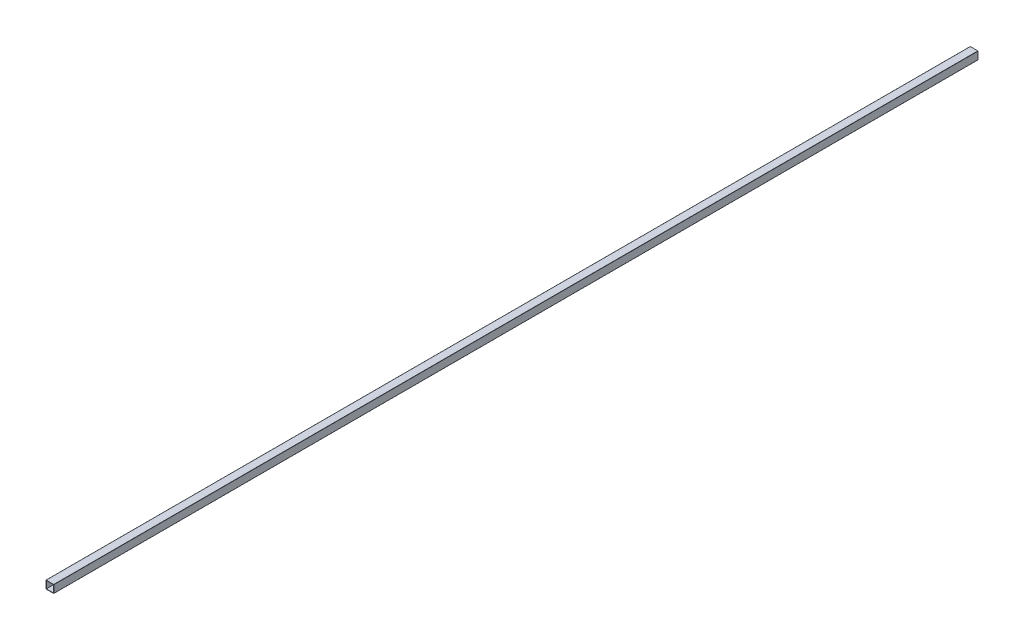
ISO-10303-21;
HEADER;
FILE_DESCRIPTION(('STEP AP214'),'2;1');
FILE_NAME('part.step','',(''),(''),'','','');
FILE_SCHEMA(('AUTOMOTIVE_DESIGN { 1 0 10303 214 1 1 1 1 }'));
ENDSEC;
DATA;
#1=APPLICATION_CONTEXT('core data for automotive mechanical design processes');
#2=APPLICATION_PROTOCOL_DEFINITION('international standard','automotive_design',2000,#1);
#3=PRODUCT_CONTEXT('',#1,'mechanical');
#4=PRODUCT('Part','Part','',(#3));
#5=PRODUCT_RELATED_PRODUCT_CATEGORY('part','',(#4));
#6=PRODUCT_DEFINITION_FORMATION('','',#4);
#7=PRODUCT_DEFINITION_CONTEXT('part definition',#1,'design');
#8=PRODUCT_DEFINITION('design','',#6,#7);
#9=PRODUCT_DEFINITION_SHAPE('','',#8);
#10=(LENGTH_UNIT() NAMED_UNIT(*) SI_UNIT(.MILLI.,.METRE.));
#11=(NAMED_UNIT(*) PLANE_ANGLE_UNIT() SI_UNIT($,.RADIAN.));
#12=(NAMED_UNIT(*) SI_UNIT($,.STERADIAN.) SOLID_ANGLE_UNIT());
#13=UNCERTAINTY_MEASURE_WITH_UNIT(LENGTH_MEASURE(1.E-05),#10,'distance_accuracy_value','');
#14=(GEOMETRIC_REPRESENTATION_CONTEXT(3) GLOBAL_UNCERTAINTY_ASSIGNED_CONTEXT((#13)) GLOBAL_UNIT_ASSIGNED_CONTEXT((#10,
#11,#12)) REPRESENTATION_CONTEXT('',''));
#15=CARTESIAN_POINT('',(0.,0.,0.));
#16=DIRECTION('',(0.,0.,1.));
#17=DIRECTION('',(1.,0.,0.));
#18=AXIS2_PLACEMENT_3D('',#15,#16,#17);
#19=CARTESIAN_POINT('',(24.4,-24.4,6000.));
#20=DIRECTION('',(0.,0.,-1.));
#21=DIRECTION('',(-1.,0.,0.));
#22=AXIS2_PLACEMENT_3D('',#19,#20,#21);
#23=PLANE('',#22);
#24=CARTESIAN_POINT('',(24.4,-24.4,6000.));
#25=DIRECTION('',(0.,0.,1.));
#26=DIRECTION('',(-1.,0.,0.));
#27=AXIS2_PLACEMENT_3D('',#24,#25,#26);
#28=CIRCLE('',#27,1.);
#29=CARTESIAN_POINT('',(24.4,-25.4,6000.));
#30=VERTEX_POINT('',#29);
#31=CARTESIAN_POINT('',(25.4,-24.4,6000.));
#32=VERTEX_POINT('',#31);
#33=EDGE_CURVE('E158',#30,#32,#28,.T.);
#34=ORIENTED_EDGE('',*,*,#33,.T.);
#35=DIRECTION('',(0.,1.,0.));
#36=VECTOR('',#35,1.);
#37=CARTESIAN_POINT('',(25.4,-24.4,6000.));
#38=LINE('',#37,#36);
#39=CARTESIAN_POINT('',(25.4,24.4,6000.));
#40=VERTEX_POINT('',#39);
#41=EDGE_CURVE('E161',#32,#40,#38,.T.);
#42=ORIENTED_EDGE('',*,*,#41,.T.);
#43=CARTESIAN_POINT('',(24.4,24.4,6000.));
#44=DIRECTION('',(0.,0.,1.));
#45=DIRECTION('',(1.,0.,0.));
#46=AXIS2_PLACEMENT_3D('',#43,#44,#45);
#47=CIRCLE('',#46,1.);
#48=CARTESIAN_POINT('',(24.4,25.4,6000.));
#49=VERTEX_POINT('',#48);
#50=EDGE_CURVE('E164',#40,#49,#47,.T.);
#51=ORIENTED_EDGE('',*,*,#50,.T.);
#52=DIRECTION('',(-1.,0.,0.));
#53=VECTOR('',#52,1.);
#54=CARTESIAN_POINT('',(-24.4,25.4,6000.));
#55=LINE('',#54,#53);
#56=CARTESIAN_POINT('',(-24.4,25.4,6000.));
#57=VERTEX_POINT('',#56);
#58=EDGE_CURVE('E166',#49,#57,#55,.T.);
#59=ORIENTED_EDGE('',*,*,#58,.T.);
#60=CARTESIAN_POINT('',(-24.4,24.4,6000.));
#61=DIRECTION('',(0.,0.,1.));
#62=DIRECTION('',(1.,0.,0.));
#63=AXIS2_PLACEMENT_3D('',#60,#61,#62);
#64=CIRCLE('',#63,1.);
#65=CARTESIAN_POINT('',(-25.4,24.4,6000.));
#66=VERTEX_POINT('',#65);
#67=EDGE_CURVE('E168',#57,#66,#64,.T.);
#68=ORIENTED_EDGE('',*,*,#67,.T.);
#69=DIRECTION('',(0.,-1.,0.));
#70=VECTOR('',#69,1.);
#71=CARTESIAN_POINT('',(-25.4,-24.4,6000.));
#72=LINE('',#71,#70);
#73=CARTESIAN_POINT('',(-25.4,-24.4,6000.));
#74=VERTEX_POINT('',#73);
#75=EDGE_CURVE('E170',#66,#74,#72,.T.);
#76=ORIENTED_EDGE('',*,*,#75,.T.);
#77=CARTESIAN_POINT('',(-24.4,-24.4,6000.));
#78=DIRECTION('',(0.,0.,1.));
#79=DIRECTION('',(1.,0.,0.));
#80=AXIS2_PLACEMENT_3D('',#77,#78,#79);
#81=CIRCLE('',#80,1.);
#82=CARTESIAN_POINT('',(-24.4,-25.4,6000.));
#83=VERTEX_POINT('',#82);
#84=EDGE_CURVE('E172',#74,#83,#81,.T.);
#85=ORIENTED_EDGE('',*,*,#84,.T.);
#86=DIRECTION('',(1.,0.,0.));
#87=VECTOR('',#86,1.);
#88=CARTESIAN_POINT('',(-24.4,-25.4,6000.));
#89=LINE('',#88,#87);
#90=EDGE_CURVE('E174',#83,#30,#89,.T.);
#91=ORIENTED_EDGE('',*,*,#90,.T.);
#92=EDGE_LOOP('',(#34,#42,#51,#59,#68,#76,#85,#91));
#93=FACE_BOUND('',#92,.T.);
#94=DIRECTION('',(1.,0.,0.));
#95=VECTOR('',#94,1.);
#96=CARTESIAN_POINT('',(-23.51,-23.51,6000.));
#97=LINE('',#96,#95);
#98=CARTESIAN_POINT('',(-23.51,-23.51,6000.));
#99=VERTEX_POINT('',#98);
#100=CARTESIAN_POINT('',(23.51,-23.51,6000.));
#101=VERTEX_POINT('',#100);
#102=EDGE_CURVE('E122',#99,#101,#97,.T.);
#103=ORIENTED_EDGE('',*,*,#102,.F.);
#104=DIRECTION('',(0.,-1.,0.));
#105=VECTOR('',#104,1.);
#106=CARTESIAN_POINT('',(-23.51,-23.51,6000.));
#107=LINE('',#106,#105);
#108=CARTESIAN_POINT('',(-23.51,23.51,6000.));
#109=VERTEX_POINT('',#108);
#110=EDGE_CURVE('E144',#109,#99,#107,.T.);
#111=ORIENTED_EDGE('',*,*,#110,.F.);
#112=DIRECTION('',(-1.,0.,0.));
#113=VECTOR('',#112,1.);
#114=CARTESIAN_POINT('',(-23.51,23.51,6000.));
#115=LINE('',#114,#113);
#116=CARTESIAN_POINT('',(23.51,23.51,6000.));
#117=VERTEX_POINT('',#116);
#118=EDGE_CURVE('E142',#117,#109,#115,.T.);
#119=ORIENTED_EDGE('',*,*,#118,.F.);
#120=DIRECTION('',(0.,1.,0.));
#121=VECTOR('',#120,1.);
#122=CARTESIAN_POINT('',(23.51,-23.51,6000.));
#123=LINE('',#122,#121);
#124=EDGE_CURVE('E130',#101,#117,#123,.T.);
#125=ORIENTED_EDGE('',*,*,#124,.F.);
#126=EDGE_LOOP('',(#103,#111,#119,#125));
#127=FACE_BOUND('',#126,.T.);
#128=ADVANCED_FACE('F33',(#93,#127),#23,.F.);
#129=CARTESIAN_POINT('',(24.4,-24.4,0.));
#130=DIRECTION('',(0.,0.,-1.));
#131=DIRECTION('',(-1.,0.,0.));
#132=AXIS2_PLACEMENT_3D('',#129,#130,#131);
#133=PLANE('',#132);
#134=CARTESIAN_POINT('',(24.4,-24.4,0.));
#135=DIRECTION('',(0.,0.,1.));
#136=DIRECTION('',(-1.,0.,0.));
#137=AXIS2_PLACEMENT_3D('',#134,#135,#136);
#138=CIRCLE('',#137,1.);
#139=CARTESIAN_POINT('',(24.4,-25.4,0.));
#140=VERTEX_POINT('',#139);
#141=CARTESIAN_POINT('',(25.4,-24.4,0.));
#142=VERTEX_POINT('',#141);
#143=EDGE_CURVE('E138',#140,#142,#138,.T.);
#144=ORIENTED_EDGE('',*,*,#143,.F.);
#145=DIRECTION('',(1.,0.,0.));
#146=VECTOR('',#145,1.);
#147=CARTESIAN_POINT('',(-24.4,-25.4,0.));
#148=LINE('',#147,#146);
#149=CARTESIAN_POINT('',(-24.4,-25.4,0.));
#150=VERTEX_POINT('',#149);
#151=EDGE_CURVE('E162',#150,#140,#148,.T.);
#152=ORIENTED_EDGE('',*,*,#151,.F.);
#153=CARTESIAN_POINT('',(-24.4,-24.4,0.));
#154=DIRECTION('',(0.,0.,1.));
#155=DIRECTION('',(1.,0.,0.));
#156=AXIS2_PLACEMENT_3D('',#153,#154,#155);
#157=CIRCLE('',#156,1.);
#158=CARTESIAN_POINT('',(-25.4,-24.4,0.));
#159=VERTEX_POINT('',#158);
#160=EDGE_CURVE('E189',#159,#150,#157,.T.);
#161=ORIENTED_EDGE('',*,*,#160,.F.);
#162=DIRECTION('',(0.,-1.,0.));
#163=VECTOR('',#162,1.);
#164=CARTESIAN_POINT('',(-25.4,-24.4,0.));
#165=LINE('',#164,#163);
#166=CARTESIAN_POINT('',(-25.4,24.4,0.));
#167=VERTEX_POINT('',#166);
#168=EDGE_CURVE('E187',#167,#159,#165,.T.);
#169=ORIENTED_EDGE('',*,*,#168,.F.);
#170=CARTESIAN_POINT('',(-24.4,24.4,0.));
#171=DIRECTION('',(0.,0.,1.));
#172=DIRECTION('',(1.,0.,0.));
#173=AXIS2_PLACEMENT_3D('',#170,#171,#172);
#174=CIRCLE('',#173,1.);
#175=CARTESIAN_POINT('',(-24.4,25.4,0.));
#176=VERTEX_POINT('',#175);
#177=EDGE_CURVE('E185',#176,#167,#174,.T.);
#178=ORIENTED_EDGE('',*,*,#177,.F.);
#179=DIRECTION('',(-1.,0.,0.));
#180=VECTOR('',#179,1.);
#181=CARTESIAN_POINT('',(-24.4,25.4,0.));
#182=LINE('',#181,#180);
#183=CARTESIAN_POINT('',(24.4,25.4,0.));
#184=VERTEX_POINT('',#183);
#185=EDGE_CURVE('E183',#184,#176,#182,.T.);
#186=ORIENTED_EDGE('',*,*,#185,.F.);
#187=CARTESIAN_POINT('',(24.4,24.4,0.));
#188=DIRECTION('',(0.,0.,1.));
#189=DIRECTION('',(1.,0.,0.));
#190=AXIS2_PLACEMENT_3D('',#187,#188,#189);
#191=CIRCLE('',#190,1.);
#192=CARTESIAN_POINT('',(25.4,24.4,0.));
#193=VERTEX_POINT('',#192);
#194=EDGE_CURVE('E181',#193,#184,#191,.T.);
#195=ORIENTED_EDGE('',*,*,#194,.F.);
#196=DIRECTION('',(0.,1.,0.));
#197=VECTOR('',#196,1.);
#198=CARTESIAN_POINT('',(25.4,-24.4,0.));
#199=LINE('',#198,#197);
#200=EDGE_CURVE('E179',#142,#193,#199,.T.);
#201=ORIENTED_EDGE('',*,*,#200,.F.);
#202=EDGE_LOOP('',(#144,#152,#161,#169,#178,#186,#195,#201));
#203=FACE_BOUND('',#202,.T.);
#204=DIRECTION('',(0.,-1.,0.));
#205=VECTOR('',#204,1.);
#206=CARTESIAN_POINT('',(-23.51,-23.51,0.));
#207=LINE('',#206,#205);
#208=CARTESIAN_POINT('',(-23.51,23.51,0.));
#209=VERTEX_POINT('',#208);
#210=CARTESIAN_POINT('',(-23.51,-23.51,0.));
#211=VERTEX_POINT('',#210);
#212=EDGE_CURVE('E131',#209,#211,#207,.T.);
#213=ORIENTED_EDGE('',*,*,#212,.T.);
#214=DIRECTION('',(1.,0.,0.));
#215=VECTOR('',#214,1.);
#216=CARTESIAN_POINT('',(-23.51,-23.51,0.));
#217=LINE('',#216,#215);
#218=CARTESIAN_POINT('',(23.51,-23.51,0.));
#219=VERTEX_POINT('',#218);
#220=EDGE_CURVE('E56',#211,#219,#217,.T.);
#221=ORIENTED_EDGE('',*,*,#220,.T.);
#222=DIRECTION('',(0.,1.,0.));
#223=VECTOR('',#222,1.);
#224=CARTESIAN_POINT('',(23.51,-23.51,0.));
#225=LINE('',#224,#223);
#226=CARTESIAN_POINT('',(23.51,23.51,0.));
#227=VERTEX_POINT('',#226);
#228=EDGE_CURVE('E137',#219,#227,#225,.T.);
#229=ORIENTED_EDGE('',*,*,#228,.T.);
#230=DIRECTION('',(-1.,0.,0.));
#231=VECTOR('',#230,1.);
#232=CARTESIAN_POINT('',(-23.51,23.51,0.));
#233=LINE('',#232,#231);
#234=EDGE_CURVE('E150',#227,#209,#233,.T.);
#235=ORIENTED_EDGE('',*,*,#234,.T.);
#236=EDGE_LOOP('',(#213,#221,#229,#235));
#237=FACE_BOUND('',#236,.T.);
#238=ADVANCED_FACE('F219',(#203,#237),#133,.T.);
#239=CARTESIAN_POINT('',(24.4,-24.4,6000.));
#240=DIRECTION('',(0.,0.,-1.));
#241=DIRECTION('',(-1.,0.,0.));
#242=AXIS2_PLACEMENT_3D('',#239,#240,#241);
#243=CYLINDRICAL_SURFACE('',#242,1.);
#244=ORIENTED_EDGE('',*,*,#143,.T.);
#245=DIRECTION('',(0.,0.,-1.));
#246=VECTOR('',#245,1.);
#247=CARTESIAN_POINT('',(25.4,-24.4,6000.));
#248=LINE('',#247,#246);
#249=EDGE_CURVE('E11',#32,#142,#248,.T.);
#250=ORIENTED_EDGE('',*,*,#249,.F.);
#251=ORIENTED_EDGE('',*,*,#33,.F.);
#252=DIRECTION('',(0.,0.,-1.));
#253=VECTOR('',#252,1.);
#254=CARTESIAN_POINT('',(24.4,-25.4,6000.));
#255=LINE('',#254,#253);
#256=EDGE_CURVE('E176',#30,#140,#255,.T.);
#257=ORIENTED_EDGE('',*,*,#256,.T.);
#258=EDGE_LOOP('',(#244,#250,#251,#257));
#259=FACE_BOUND('',#258,.T.);
#260=ADVANCED_FACE('F35',(#259),#243,.T.);
#261=CARTESIAN_POINT('',(25.4,-24.4,6000.));
#262=DIRECTION('',(-1.,0.,0.));
#263=DIRECTION('',(0.,0.,1.));
#264=AXIS2_PLACEMENT_3D('',#261,#262,#263);
#265=PLANE('',#264);
#266=ORIENTED_EDGE('',*,*,#200,.T.);
#267=DIRECTION('',(0.,0.,-1.));
#268=VECTOR('',#267,1.);
#269=CARTESIAN_POINT('',(25.4,24.4,6000.));
#270=LINE('',#269,#268);
#271=EDGE_CURVE('E41',#40,#193,#270,.T.);
#272=ORIENTED_EDGE('',*,*,#271,.F.);
#273=ORIENTED_EDGE('',*,*,#41,.F.);
#274=ORIENTED_EDGE('',*,*,#249,.T.);
#275=EDGE_LOOP('',(#266,#272,#273,#274));
#276=FACE_BOUND('',#275,.T.);
#277=ADVANCED_FACE('F236',(#276),#265,.F.);
#278=CARTESIAN_POINT('',(24.4,24.4,6000.));
#279=DIRECTION('',(0.,0.,-1.));
#280=DIRECTION('',(-1.,0.,0.));
#281=AXIS2_PLACEMENT_3D('',#278,#279,#280);
#282=CYLINDRICAL_SURFACE('',#281,1.);
#283=ORIENTED_EDGE('',*,*,#194,.T.);
#284=DIRECTION('',(0.,0.,-1.));
#285=VECTOR('',#284,1.);
#286=CARTESIAN_POINT('',(24.4,25.4,6000.));
#287=LINE('',#286,#285);
#288=EDGE_CURVE('E206',#49,#184,#287,.T.);
#289=ORIENTED_EDGE('',*,*,#288,.F.);
#290=ORIENTED_EDGE('',*,*,#50,.F.);
#291=ORIENTED_EDGE('',*,*,#271,.T.);
#292=EDGE_LOOP('',(#283,#289,#290,#291));
#293=FACE_BOUND('',#292,.T.);
#294=ADVANCED_FACE('F213',(#293),#282,.T.);
#295=CARTESIAN_POINT('',(-24.4,25.4,6000.));
#296=DIRECTION('',(0.,-1.,0.));
#297=DIRECTION('',(0.,0.,-1.));
#298=AXIS2_PLACEMENT_3D('',#295,#296,#297);
#299=PLANE('',#298);
#300=ORIENTED_EDGE('',*,*,#185,.T.);
#301=DIRECTION('',(0.,0.,-1.));
#302=VECTOR('',#301,1.);
#303=CARTESIAN_POINT('',(-24.4,25.4,6000.));
#304=LINE('',#303,#302);
#305=EDGE_CURVE('E203',#57,#176,#304,.T.);
#306=ORIENTED_EDGE('',*,*,#305,.F.);
#307=ORIENTED_EDGE('',*,*,#58,.F.);
#308=ORIENTED_EDGE('',*,*,#288,.T.);
#309=EDGE_LOOP('',(#300,#306,#307,#308));
#310=FACE_BOUND('',#309,.T.);
#311=ADVANCED_FACE('F225',(#310),#299,.F.);
#312=CARTESIAN_POINT('',(-24.4,24.4,6000.));
#313=DIRECTION('',(0.,0.,-1.));
#314=DIRECTION('',(-1.,0.,0.));
#315=AXIS2_PLACEMENT_3D('',#312,#313,#314);
#316=CYLINDRICAL_SURFACE('',#315,1.);
#317=ORIENTED_EDGE('',*,*,#177,.T.);
#318=DIRECTION('',(0.,0.,-1.));
#319=VECTOR('',#318,1.);
#320=CARTESIAN_POINT('',(-25.4,24.4,6000.));
#321=LINE('',#320,#319);
#322=EDGE_CURVE('E200',#66,#167,#321,.T.);
#323=ORIENTED_EDGE('',*,*,#322,.F.);
#324=ORIENTED_EDGE('',*,*,#67,.F.);
#325=ORIENTED_EDGE('',*,*,#305,.T.);
#326=EDGE_LOOP('',(#317,#323,#324,#325));
#327=FACE_BOUND('',#326,.T.);
#328=ADVANCED_FACE('F229',(#327),#316,.T.);
#329=CARTESIAN_POINT('',(-25.4,-24.4,6000.));
#330=DIRECTION('',(1.,0.,0.));
#331=DIRECTION('',(0.,0.,-1.));
#332=AXIS2_PLACEMENT_3D('',#329,#330,#331);
#333=PLANE('',#332);
#334=ORIENTED_EDGE('',*,*,#168,.T.);
#335=DIRECTION('',(0.,0.,-1.));
#336=VECTOR('',#335,1.);
#337=CARTESIAN_POINT('',(-25.4,-24.4,6000.));
#338=LINE('',#337,#336);
#339=EDGE_CURVE('E197',#74,#159,#338,.T.);
#340=ORIENTED_EDGE('',*,*,#339,.F.);
#341=ORIENTED_EDGE('',*,*,#75,.F.);
#342=ORIENTED_EDGE('',*,*,#322,.T.);
#343=EDGE_LOOP('',(#334,#340,#341,#342));
#344=FACE_BOUND('',#343,.T.);
#345=ADVANCED_FACE('F249',(#344),#333,.F.);
#346=CARTESIAN_POINT('',(-24.4,-24.4,6000.));
#347=DIRECTION('',(0.,0.,-1.));
#348=DIRECTION('',(-1.,0.,0.));
#349=AXIS2_PLACEMENT_3D('',#346,#347,#348);
#350=CYLINDRICAL_SURFACE('',#349,1.);
#351=ORIENTED_EDGE('',*,*,#160,.T.);
#352=DIRECTION('',(0.,0.,-1.));
#353=VECTOR('',#352,1.);
#354=CARTESIAN_POINT('',(-24.4,-25.4,6000.));
#355=LINE('',#354,#353);
#356=EDGE_CURVE('E194',#83,#150,#355,.T.);
#357=ORIENTED_EDGE('',*,*,#356,.F.);
#358=ORIENTED_EDGE('',*,*,#84,.F.);
#359=ORIENTED_EDGE('',*,*,#339,.T.);
#360=EDGE_LOOP('',(#351,#357,#358,#359));
#361=FACE_BOUND('',#360,.T.);
#362=ADVANCED_FACE('F247',(#361),#350,.T.);
#363=CARTESIAN_POINT('',(-24.4,-25.4,6000.));
#364=DIRECTION('',(0.,1.,0.));
#365=DIRECTION('',(0.,0.,1.));
#366=AXIS2_PLACEMENT_3D('',#363,#364,#365);
#367=PLANE('',#366);
#368=ORIENTED_EDGE('',*,*,#151,.T.);
#369=ORIENTED_EDGE('',*,*,#256,.F.);
#370=ORIENTED_EDGE('',*,*,#90,.F.);
#371=ORIENTED_EDGE('',*,*,#356,.T.);
#372=EDGE_LOOP('',(#368,#369,#370,#371));
#373=FACE_BOUND('',#372,.T.);
#374=ADVANCED_FACE('F242',(#373),#367,.F.);
#375=CARTESIAN_POINT('',(-23.51,-23.51,6000.));
#376=DIRECTION('',(0.,1.,0.));
#377=DIRECTION('',(0.,0.,1.));
#378=AXIS2_PLACEMENT_3D('',#375,#376,#377);
#379=PLANE('',#378);
#380=ORIENTED_EDGE('',*,*,#220,.F.);
#381=DIRECTION('',(0.,0.,-1.));
#382=VECTOR('',#381,1.);
#383=CARTESIAN_POINT('',(-23.51,-23.51,6000.));
#384=LINE('',#383,#382);
#385=EDGE_CURVE('E126',#99,#211,#384,.T.);
#386=ORIENTED_EDGE('',*,*,#385,.F.);
#387=ORIENTED_EDGE('',*,*,#102,.T.);
#388=DIRECTION('',(0.,0.,-1.));
#389=VECTOR('',#388,1.);
#390=CARTESIAN_POINT('',(23.51,-23.51,6000.));
#391=LINE('',#390,#389);
#392=EDGE_CURVE('E125',#101,#219,#391,.T.);
#393=ORIENTED_EDGE('',*,*,#392,.T.);
#394=EDGE_LOOP('',(#380,#386,#387,#393));
#395=FACE_BOUND('',#394,.T.);
#396=ADVANCED_FACE('F124',(#395),#379,.T.);
#397=CARTESIAN_POINT('',(23.51,-23.51,6000.));
#398=DIRECTION('',(-1.,0.,0.));
#399=DIRECTION('',(0.,-1.,0.));
#400=AXIS2_PLACEMENT_3D('',#397,#398,#399);
#401=PLANE('',#400);
#402=ORIENTED_EDGE('',*,*,#228,.F.);
#403=ORIENTED_EDGE('',*,*,#392,.F.);
#404=ORIENTED_EDGE('',*,*,#124,.T.);
#405=DIRECTION('',(0.,0.,-1.));
#406=VECTOR('',#405,1.);
#407=CARTESIAN_POINT('',(23.51,23.51,6000.));
#408=LINE('',#407,#406);
#409=EDGE_CURVE('E139',#117,#227,#408,.T.);
#410=ORIENTED_EDGE('',*,*,#409,.T.);
#411=EDGE_LOOP('',(#402,#403,#404,#410));
#412=FACE_BOUND('',#411,.T.);
#413=ADVANCED_FACE('F134',(#412),#401,.T.);
#414=CARTESIAN_POINT('',(-23.51,23.51,6000.));
#415=DIRECTION('',(0.,-1.,0.));
#416=DIRECTION('',(0.,0.,-1.));
#417=AXIS2_PLACEMENT_3D('',#414,#415,#416);
#418=PLANE('',#417);
#419=ORIENTED_EDGE('',*,*,#234,.F.);
#420=ORIENTED_EDGE('',*,*,#409,.F.);
#421=ORIENTED_EDGE('',*,*,#118,.T.);
#422=DIRECTION('',(0.,0.,-1.));
#423=VECTOR('',#422,1.);
#424=CARTESIAN_POINT('',(-23.51,23.51,6000.));
#425=LINE('',#424,#423);
#426=EDGE_CURVE('E48',#109,#209,#425,.T.);
#427=ORIENTED_EDGE('',*,*,#426,.T.);
#428=EDGE_LOOP('',(#419,#420,#421,#427));
#429=FACE_BOUND('',#428,.T.);
#430=ADVANCED_FACE('F274',(#429),#418,.T.);
#431=CARTESIAN_POINT('',(-23.51,-23.51,6000.));
#432=DIRECTION('',(1.,0.,0.));
#433=DIRECTION('',(0.,0.,-1.));
#434=AXIS2_PLACEMENT_3D('',#431,#432,#433);
#435=PLANE('',#434);
#436=ORIENTED_EDGE('',*,*,#212,.F.);
#437=ORIENTED_EDGE('',*,*,#426,.F.);
#438=ORIENTED_EDGE('',*,*,#110,.T.);
#439=ORIENTED_EDGE('',*,*,#385,.T.);
#440=EDGE_LOOP('',(#436,#437,#438,#439));
#441=FACE_BOUND('',#440,.T.);
#442=ADVANCED_FACE('F278',(#441),#435,.T.);
#443=CLOSED_SHELL('',(#128,#238,#260,#277,#294,#311,#328,#345,#362,#374,#396,#413,#430,#442));
#444=MANIFOLD_SOLID_BREP('B2',#443);
#445=ADVANCED_BREP_SHAPE_REPRESENTATION('',(#18,#444),#14);
#446=SHAPE_DEFINITION_REPRESENTATION(#9,#445);
ENDSEC;
END-ISO-10303-21;
